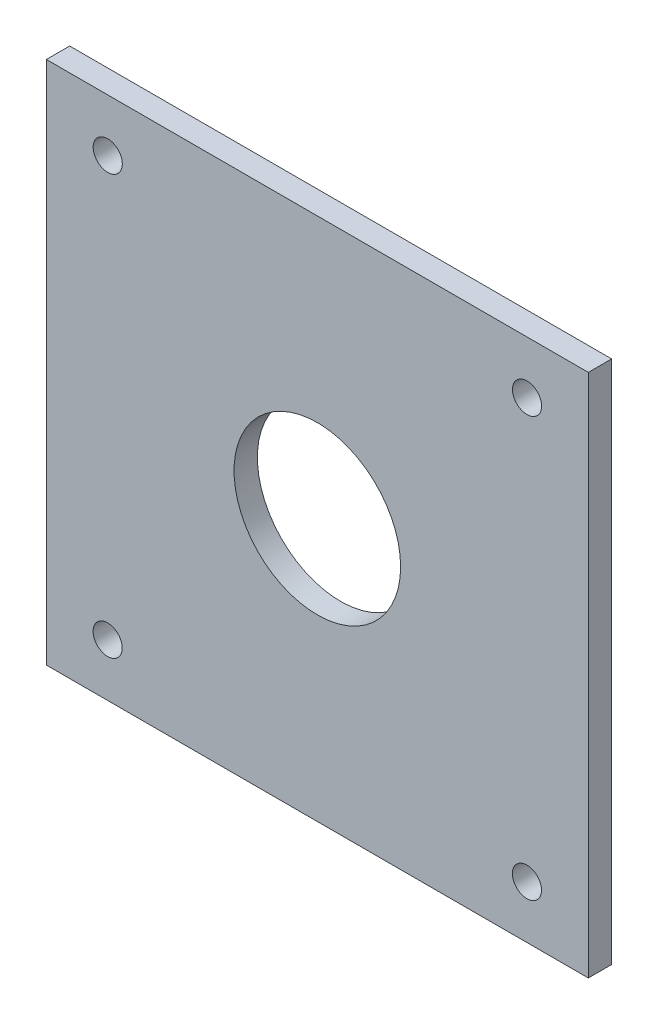
ISO-10303-21;
HEADER;
FILE_DESCRIPTION(('STEP AP214'),'2;1');
FILE_NAME('part.step','',(''),(''),'','','');
FILE_SCHEMA(('AUTOMOTIVE_DESIGN { 1 0 10303 214 1 1 1 1 }'));
ENDSEC;
DATA;
#1=APPLICATION_CONTEXT('core data for automotive mechanical design processes');
#2=APPLICATION_PROTOCOL_DEFINITION('international standard','automotive_design',2000,#1);
#3=PRODUCT_CONTEXT('',#1,'mechanical');
#4=PRODUCT('Part','Part','',(#3));
#5=PRODUCT_RELATED_PRODUCT_CATEGORY('part','',(#4));
#6=PRODUCT_DEFINITION_FORMATION('','',#4);
#7=PRODUCT_DEFINITION_CONTEXT('part definition',#1,'design');
#8=PRODUCT_DEFINITION('design','',#6,#7);
#9=PRODUCT_DEFINITION_SHAPE('','',#8);
#10=(LENGTH_UNIT() NAMED_UNIT(*) SI_UNIT(.MILLI.,.METRE.));
#11=(NAMED_UNIT(*) PLANE_ANGLE_UNIT() SI_UNIT($,.RADIAN.));
#12=(NAMED_UNIT(*) SI_UNIT($,.STERADIAN.) SOLID_ANGLE_UNIT());
#13=UNCERTAINTY_MEASURE_WITH_UNIT(LENGTH_MEASURE(1.E-05),#10,'distance_accuracy_value','');
#14=(GEOMETRIC_REPRESENTATION_CONTEXT(3) GLOBAL_UNCERTAINTY_ASSIGNED_CONTEXT((#13)) GLOBAL_UNIT_ASSIGNED_CONTEXT((#10,
#11,#12)) REPRESENTATION_CONTEXT('',''));
#15=CARTESIAN_POINT('',(0.,0.,0.));
#16=DIRECTION('',(0.,0.,1.));
#17=DIRECTION('',(1.,0.,0.));
#18=AXIS2_PLACEMENT_3D('',#15,#16,#17);
#19=CARTESIAN_POINT('',(0.,0.,4.));
#20=DIRECTION('',(0.,0.,1.));
#21=DIRECTION('',(1.,0.,0.));
#22=AXIS2_PLACEMENT_3D('',#19,#20,#21);
#23=PLANE('',#22);
#24=CARTESIAN_POINT('',(35.9814986321367,35.966614813846,4.));
#25=DIRECTION('',(0.,0.,1.));
#26=DIRECTION('',(1.,0.,0.));
#27=AXIS2_PLACEMENT_3D('',#24,#25,#26);
#28=CIRCLE('',#27,2.50000000000001);
#29=CARTESIAN_POINT('',(38.4814986321367,35.966614813846,4.));
#30=VERTEX_POINT('',#29);
#31=EDGE_CURVE('E127',#30,#30,#28,.T.);
#32=ORIENTED_EDGE('',*,*,#31,.F.);
#33=EDGE_LOOP('',(#32));
#34=FACE_BOUND('',#33,.T.);
#35=CARTESIAN_POINT('',(-35.9814986321365,-35.9666148138462,4.));
#36=DIRECTION('',(0.,0.,1.));
#37=DIRECTION('',(1.,0.,0.));
#38=AXIS2_PLACEMENT_3D('',#35,#36,#37);
#39=CIRCLE('',#38,2.5);
#40=CARTESIAN_POINT('',(-33.4814986321365,-35.9666148138462,4.));
#41=VERTEX_POINT('',#40);
#42=EDGE_CURVE('E115',#41,#41,#39,.T.);
#43=ORIENTED_EDGE('',*,*,#42,.F.);
#44=EDGE_LOOP('',(#43));
#45=FACE_BOUND('',#44,.T.);
#46=DIRECTION('',(0.,-1.,0.));
#47=VECTOR('',#46,1.);
#48=CARTESIAN_POINT('',(-46.5,-45.,4.));
#49=LINE('',#48,#47);
#50=CARTESIAN_POINT('',(-46.5,45.,4.));
#51=VERTEX_POINT('',#50);
#52=CARTESIAN_POINT('',(-46.5,-45.,4.));
#53=VERTEX_POINT('',#52);
#54=EDGE_CURVE('E85',#51,#53,#49,.T.);
#55=ORIENTED_EDGE('',*,*,#54,.T.);
#56=DIRECTION('',(1.,0.,0.));
#57=VECTOR('',#56,1.);
#58=CARTESIAN_POINT('',(46.5,-45.,4.));
#59=LINE('',#58,#57);
#60=CARTESIAN_POINT('',(46.5,-45.,4.));
#61=VERTEX_POINT('',#60);
#62=EDGE_CURVE('E80',#53,#61,#59,.T.);
#63=ORIENTED_EDGE('',*,*,#62,.T.);
#64=DIRECTION('',(0.,1.,0.));
#65=VECTOR('',#64,1.);
#66=CARTESIAN_POINT('',(46.5,-45.,4.));
#67=LINE('',#66,#65);
#68=CARTESIAN_POINT('',(46.5,45.,4.));
#69=VERTEX_POINT('',#68);
#70=EDGE_CURVE('E83',#61,#69,#67,.T.);
#71=ORIENTED_EDGE('',*,*,#70,.T.);
#72=DIRECTION('',(-1.,0.,0.));
#73=VECTOR('',#72,1.);
#74=CARTESIAN_POINT('',(46.5,45.,4.));
#75=LINE('',#74,#73);
#76=EDGE_CURVE('E50',#69,#51,#75,.T.);
#77=ORIENTED_EDGE('',*,*,#76,.T.);
#78=EDGE_LOOP('',(#55,#63,#71,#77));
#79=FACE_BOUND('',#78,.T.);
#80=CARTESIAN_POINT('',(0.,0.,4.));
#81=DIRECTION('',(0.,0.,1.));
#82=DIRECTION('',(1.,0.,0.));
#83=AXIS2_PLACEMENT_3D('',#80,#81,#82);
#84=CIRCLE('',#83,14.29);
#85=CARTESIAN_POINT('',(14.29,0.,4.));
#86=VERTEX_POINT('',#85);
#87=EDGE_CURVE('E100',#86,#86,#84,.T.);
#88=ORIENTED_EDGE('',*,*,#87,.F.);
#89=EDGE_LOOP('',(#88));
#90=FACE_BOUND('',#89,.T.);
#91=CARTESIAN_POINT('',(-35.9666148138461,35.9814986321366,4.));
#92=DIRECTION('',(0.,0.,1.));
#93=DIRECTION('',(1.,0.,0.));
#94=AXIS2_PLACEMENT_3D('',#91,#92,#93);
#95=CIRCLE('',#94,2.5);
#96=CARTESIAN_POINT('',(-33.4666148138461,35.9814986321366,4.));
#97=VERTEX_POINT('',#96);
#98=EDGE_CURVE('E121',#97,#97,#95,.T.);
#99=ORIENTED_EDGE('',*,*,#98,.F.);
#100=EDGE_LOOP('',(#99));
#101=FACE_BOUND('',#100,.T.);
#102=CARTESIAN_POINT('',(35.9666148138458,-35.9814986321368,4.));
#103=DIRECTION('',(0.,0.,1.));
#104=DIRECTION('',(1.,0.,0.));
#105=AXIS2_PLACEMENT_3D('',#102,#103,#104);
#106=CIRCLE('',#105,2.5);
#107=CARTESIAN_POINT('',(38.4666148138458,-35.9814986321368,4.));
#108=VERTEX_POINT('',#107);
#109=EDGE_CURVE('E133',#108,#108,#106,.T.);
#110=ORIENTED_EDGE('',*,*,#109,.F.);
#111=EDGE_LOOP('',(#110));
#112=FACE_BOUND('',#111,.T.);
#113=ADVANCED_FACE('F33',(#34,#45,#79,#90,#101,#112),#23,.T.);
#114=CARTESIAN_POINT('',(0.,0.,0.));
#115=DIRECTION('',(0.,0.,1.));
#116=DIRECTION('',(1.,0.,0.));
#117=AXIS2_PLACEMENT_3D('',#114,#115,#116);
#118=PLANE('',#117);
#119=DIRECTION('',(0.,-1.,0.));
#120=VECTOR('',#119,1.);
#121=CARTESIAN_POINT('',(-46.5,-45.,0.));
#122=LINE('',#121,#120);
#123=CARTESIAN_POINT('',(-46.5,45.,0.));
#124=VERTEX_POINT('',#123);
#125=CARTESIAN_POINT('',(-46.5,-45.,0.));
#126=VERTEX_POINT('',#125);
#127=EDGE_CURVE('E97',#124,#126,#122,.T.);
#128=ORIENTED_EDGE('',*,*,#127,.F.);
#129=DIRECTION('',(-1.,0.,0.));
#130=VECTOR('',#129,1.);
#131=CARTESIAN_POINT('',(46.5,45.,0.));
#132=LINE('',#131,#130);
#133=CARTESIAN_POINT('',(46.5,45.,0.));
#134=VERTEX_POINT('',#133);
#135=EDGE_CURVE('E73',#134,#124,#132,.T.);
#136=ORIENTED_EDGE('',*,*,#135,.F.);
#137=DIRECTION('',(0.,1.,0.));
#138=VECTOR('',#137,1.);
#139=CARTESIAN_POINT('',(46.5,-45.,0.));
#140=LINE('',#139,#138);
#141=CARTESIAN_POINT('',(46.5,-45.,0.));
#142=VERTEX_POINT('',#141);
#143=EDGE_CURVE('E67',#142,#134,#140,.T.);
#144=ORIENTED_EDGE('',*,*,#143,.F.);
#145=DIRECTION('',(1.,0.,0.));
#146=VECTOR('',#145,1.);
#147=CARTESIAN_POINT('',(46.5,-45.,0.));
#148=LINE('',#147,#146);
#149=EDGE_CURVE('E89',#126,#142,#148,.T.);
#150=ORIENTED_EDGE('',*,*,#149,.F.);
#151=EDGE_LOOP('',(#128,#136,#144,#150));
#152=FACE_BOUND('',#151,.T.);
#153=CARTESIAN_POINT('',(0.,0.,0.));
#154=DIRECTION('',(0.,0.,1.));
#155=DIRECTION('',(1.,0.,0.));
#156=AXIS2_PLACEMENT_3D('',#153,#154,#155);
#157=CIRCLE('',#156,14.29);
#158=CARTESIAN_POINT('',(14.29,0.,0.));
#159=VERTEX_POINT('',#158);
#160=EDGE_CURVE('E112',#159,#159,#157,.T.);
#161=ORIENTED_EDGE('',*,*,#160,.T.);
#162=EDGE_LOOP('',(#161));
#163=FACE_BOUND('',#162,.T.);
#164=CARTESIAN_POINT('',(-35.9814986321365,-35.9666148138462,0.));
#165=DIRECTION('',(0.,0.,1.));
#166=DIRECTION('',(1.,0.,0.));
#167=AXIS2_PLACEMENT_3D('',#164,#165,#166);
#168=CIRCLE('',#167,2.5);
#169=CARTESIAN_POINT('',(-33.4814986321365,-35.9666148138462,0.));
#170=VERTEX_POINT('',#169);
#171=EDGE_CURVE('E118',#170,#170,#168,.T.);
#172=ORIENTED_EDGE('',*,*,#171,.T.);
#173=EDGE_LOOP('',(#172));
#174=FACE_BOUND('',#173,.T.);
#175=CARTESIAN_POINT('',(-35.9666148138461,35.9814986321366,0.));
#176=DIRECTION('',(0.,0.,1.));
#177=DIRECTION('',(1.,0.,0.));
#178=AXIS2_PLACEMENT_3D('',#175,#176,#177);
#179=CIRCLE('',#178,2.5);
#180=CARTESIAN_POINT('',(-33.4666148138461,35.9814986321366,0.));
#181=VERTEX_POINT('',#180);
#182=EDGE_CURVE('E124',#181,#181,#179,.T.);
#183=ORIENTED_EDGE('',*,*,#182,.T.);
#184=EDGE_LOOP('',(#183));
#185=FACE_BOUND('',#184,.T.);
#186=CARTESIAN_POINT('',(35.9814986321367,35.966614813846,0.));
#187=DIRECTION('',(0.,0.,1.));
#188=DIRECTION('',(1.,0.,0.));
#189=AXIS2_PLACEMENT_3D('',#186,#187,#188);
#190=CIRCLE('',#189,2.50000000000001);
#191=CARTESIAN_POINT('',(38.4814986321367,35.966614813846,0.));
#192=VERTEX_POINT('',#191);
#193=EDGE_CURVE('E130',#192,#192,#190,.T.);
#194=ORIENTED_EDGE('',*,*,#193,.T.);
#195=EDGE_LOOP('',(#194));
#196=FACE_BOUND('',#195,.T.);
#197=CARTESIAN_POINT('',(35.9666148138458,-35.9814986321368,0.));
#198=DIRECTION('',(0.,0.,1.));
#199=DIRECTION('',(1.,0.,0.));
#200=AXIS2_PLACEMENT_3D('',#197,#198,#199);
#201=CIRCLE('',#200,2.5);
#202=CARTESIAN_POINT('',(38.4666148138458,-35.9814986321368,0.));
#203=VERTEX_POINT('',#202);
#204=EDGE_CURVE('E136',#203,#203,#201,.T.);
#205=ORIENTED_EDGE('',*,*,#204,.T.);
#206=EDGE_LOOP('',(#205));
#207=FACE_BOUND('',#206,.T.);
#208=ADVANCED_FACE('F108',(#152,#163,#174,#185,#196,#207),#118,.F.);
#209=CARTESIAN_POINT('',(-46.5,-45.,4.));
#210=DIRECTION('',(1.,0.,0.));
#211=DIRECTION('',(0.,0.,-1.));
#212=AXIS2_PLACEMENT_3D('',#209,#210,#211);
#213=PLANE('',#212);
#214=ORIENTED_EDGE('',*,*,#127,.T.);
#215=DIRECTION('',(0.,0.,-1.));
#216=VECTOR('',#215,1.);
#217=CARTESIAN_POINT('',(-46.5,-45.,4.));
#218=LINE('',#217,#216);
#219=EDGE_CURVE('E11',#53,#126,#218,.T.);
#220=ORIENTED_EDGE('',*,*,#219,.F.);
#221=ORIENTED_EDGE('',*,*,#54,.F.);
#222=DIRECTION('',(0.,0.,-1.));
#223=VECTOR('',#222,1.);
#224=CARTESIAN_POINT('',(-46.5,45.,4.));
#225=LINE('',#224,#223);
#226=EDGE_CURVE('E93',#51,#124,#225,.T.);
#227=ORIENTED_EDGE('',*,*,#226,.T.);
#228=EDGE_LOOP('',(#214,#220,#221,#227));
#229=FACE_BOUND('',#228,.T.);
#230=ADVANCED_FACE('F35',(#229),#213,.F.);
#231=CARTESIAN_POINT('',(46.5,-45.,4.));
#232=DIRECTION('',(0.,1.,0.));
#233=DIRECTION('',(-1.,0.,0.));
#234=AXIS2_PLACEMENT_3D('',#231,#232,#233);
#235=PLANE('',#234);
#236=ORIENTED_EDGE('',*,*,#149,.T.);
#237=DIRECTION('',(0.,0.,-1.));
#238=VECTOR('',#237,1.);
#239=CARTESIAN_POINT('',(46.5,-45.,4.));
#240=LINE('',#239,#238);
#241=EDGE_CURVE('E42',#61,#142,#240,.T.);
#242=ORIENTED_EDGE('',*,*,#241,.F.);
#243=ORIENTED_EDGE('',*,*,#62,.F.);
#244=ORIENTED_EDGE('',*,*,#219,.T.);
#245=EDGE_LOOP('',(#236,#242,#243,#244));
#246=FACE_BOUND('',#245,.T.);
#247=ADVANCED_FACE('F88',(#246),#235,.F.);
#248=CARTESIAN_POINT('',(46.5,-45.,4.));
#249=DIRECTION('',(-1.,0.,0.));
#250=DIRECTION('',(0.,0.,1.));
#251=AXIS2_PLACEMENT_3D('',#248,#249,#250);
#252=PLANE('',#251);
#253=ORIENTED_EDGE('',*,*,#143,.T.);
#254=DIRECTION('',(0.,0.,-1.));
#255=VECTOR('',#254,1.);
#256=CARTESIAN_POINT('',(46.5,45.,4.));
#257=LINE('',#256,#255);
#258=EDGE_CURVE('E90',#69,#134,#257,.T.);
#259=ORIENTED_EDGE('',*,*,#258,.F.);
#260=ORIENTED_EDGE('',*,*,#70,.F.);
#261=ORIENTED_EDGE('',*,*,#241,.T.);
#262=EDGE_LOOP('',(#253,#259,#260,#261));
#263=FACE_BOUND('',#262,.T.);
#264=ADVANCED_FACE('F91',(#263),#252,.F.);
#265=CARTESIAN_POINT('',(46.5,45.,4.));
#266=DIRECTION('',(0.,-1.,0.));
#267=DIRECTION('',(1.,0.,0.));
#268=AXIS2_PLACEMENT_3D('',#265,#266,#267);
#269=PLANE('',#268);
#270=ORIENTED_EDGE('',*,*,#135,.T.);
#271=ORIENTED_EDGE('',*,*,#226,.F.);
#272=ORIENTED_EDGE('',*,*,#76,.F.);
#273=ORIENTED_EDGE('',*,*,#258,.T.);
#274=EDGE_LOOP('',(#270,#271,#272,#273));
#275=FACE_BOUND('',#274,.T.);
#276=ADVANCED_FACE('F105',(#275),#269,.F.);
#277=CARTESIAN_POINT('',(0.,0.,4.));
#278=DIRECTION('',(0.,0.,-1.));
#279=DIRECTION('',(-1.,0.,0.));
#280=AXIS2_PLACEMENT_3D('',#277,#278,#279);
#281=CYLINDRICAL_SURFACE('',#280,14.29);
#282=ORIENTED_EDGE('',*,*,#87,.T.);
#283=EDGE_LOOP('',(#282));
#284=FACE_BOUND('',#283,.T.);
#285=ORIENTED_EDGE('',*,*,#160,.F.);
#286=EDGE_LOOP('',(#285));
#287=FACE_BOUND('',#286,.T.);
#288=ADVANCED_FACE('F155',(#284,#287),#281,.F.);
#289=CARTESIAN_POINT('',(-35.9814986321365,-35.9666148138462,4.));
#290=DIRECTION('',(0.,0.,-1.));
#291=DIRECTION('',(-1.,0.,0.));
#292=AXIS2_PLACEMENT_3D('',#289,#290,#291);
#293=CYLINDRICAL_SURFACE('',#292,2.5);
#294=ORIENTED_EDGE('',*,*,#42,.T.);
#295=EDGE_LOOP('',(#294));
#296=FACE_BOUND('',#295,.T.);
#297=ORIENTED_EDGE('',*,*,#171,.F.);
#298=EDGE_LOOP('',(#297));
#299=FACE_BOUND('',#298,.T.);
#300=ADVANCED_FACE('F201',(#296,#299),#293,.F.);
#301=CARTESIAN_POINT('',(-35.9666148138461,35.9814986321366,4.));
#302=DIRECTION('',(0.,0.,-1.));
#303=DIRECTION('',(-1.,0.,0.));
#304=AXIS2_PLACEMENT_3D('',#301,#302,#303);
#305=CYLINDRICAL_SURFACE('',#304,2.5);
#306=ORIENTED_EDGE('',*,*,#98,.T.);
#307=EDGE_LOOP('',(#306));
#308=FACE_BOUND('',#307,.T.);
#309=ORIENTED_EDGE('',*,*,#182,.F.);
#310=EDGE_LOOP('',(#309));
#311=FACE_BOUND('',#310,.T.);
#312=ADVANCED_FACE('F209',(#308,#311),#305,.F.);
#313=CARTESIAN_POINT('',(35.9814986321367,35.966614813846,4.));
#314=DIRECTION('',(0.,0.,-1.));
#315=DIRECTION('',(-1.,0.,0.));
#316=AXIS2_PLACEMENT_3D('',#313,#314,#315);
#317=CYLINDRICAL_SURFACE('',#316,2.50000000000001);
#318=ORIENTED_EDGE('',*,*,#31,.T.);
#319=EDGE_LOOP('',(#318));
#320=FACE_BOUND('',#319,.T.);
#321=ORIENTED_EDGE('',*,*,#193,.F.);
#322=EDGE_LOOP('',(#321));
#323=FACE_BOUND('',#322,.T.);
#324=ADVANCED_FACE('F217',(#320,#323),#317,.F.);
#325=CARTESIAN_POINT('',(35.9666148138458,-35.9814986321368,4.));
#326=DIRECTION('',(0.,0.,-1.));
#327=DIRECTION('',(-1.,0.,0.));
#328=AXIS2_PLACEMENT_3D('',#325,#326,#327);
#329=CYLINDRICAL_SURFACE('',#328,2.5);
#330=ORIENTED_EDGE('',*,*,#109,.T.);
#331=EDGE_LOOP('',(#330));
#332=FACE_BOUND('',#331,.T.);
#333=ORIENTED_EDGE('',*,*,#204,.F.);
#334=EDGE_LOOP('',(#333));
#335=FACE_BOUND('',#334,.T.);
#336=ADVANCED_FACE('F142',(#332,#335),#329,.F.);
#337=CLOSED_SHELL('',(#113,#208,#230,#247,#264,#276,#288,#300,#312,#324,#336));
#338=MANIFOLD_SOLID_BREP('B2',#337);
#339=ADVANCED_BREP_SHAPE_REPRESENTATION('',(#18,#338),#14);
#340=SHAPE_DEFINITION_REPRESENTATION(#9,#339);
ENDSEC;
END-ISO-10303-21;
